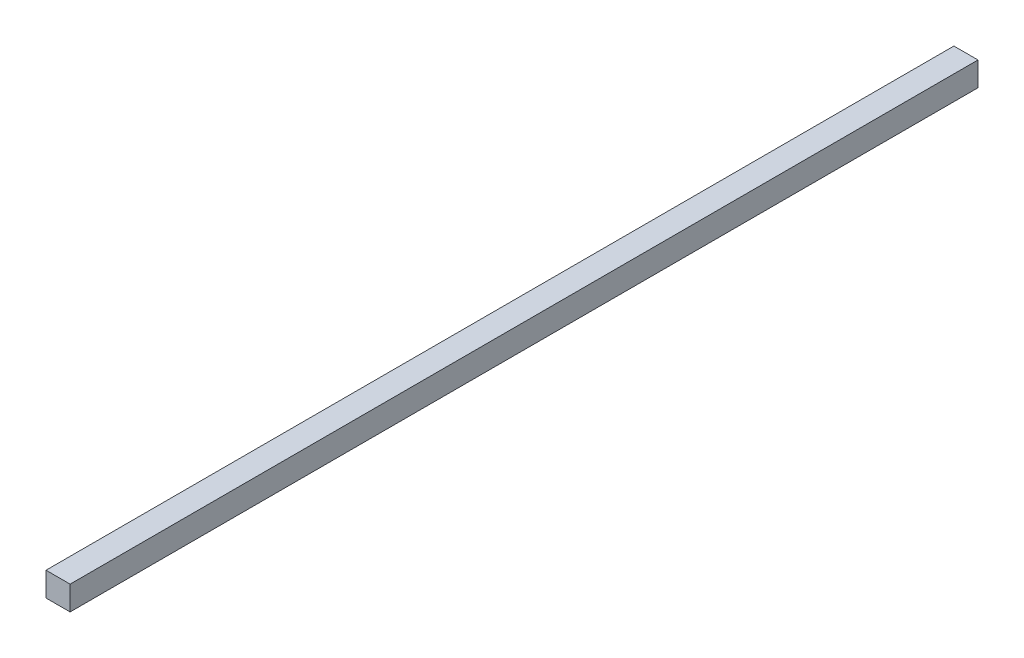
ISO-10303-21;
HEADER;
FILE_DESCRIPTION(('STEP AP214'),'2;1');
FILE_NAME('part.step','',(''),(''),'','','');
FILE_SCHEMA(('AUTOMOTIVE_DESIGN { 1 0 10303 214 1 1 1 1 }'));
ENDSEC;
DATA;
#1=APPLICATION_CONTEXT('core data for automotive mechanical design processes');
#2=APPLICATION_PROTOCOL_DEFINITION('international standard','automotive_design',2000,#1);
#3=PRODUCT_CONTEXT('',#1,'mechanical');
#4=PRODUCT('Part','Part','',(#3));
#5=PRODUCT_RELATED_PRODUCT_CATEGORY('part','',(#4));
#6=PRODUCT_DEFINITION_FORMATION('','',#4);
#7=PRODUCT_DEFINITION_CONTEXT('part definition',#1,'design');
#8=PRODUCT_DEFINITION('design','',#6,#7);
#9=PRODUCT_DEFINITION_SHAPE('','',#8);
#10=(LENGTH_UNIT() NAMED_UNIT(*) SI_UNIT(.MILLI.,.METRE.));
#11=(NAMED_UNIT(*) PLANE_ANGLE_UNIT() SI_UNIT($,.RADIAN.));
#12=(NAMED_UNIT(*) SI_UNIT($,.STERADIAN.) SOLID_ANGLE_UNIT());
#13=UNCERTAINTY_MEASURE_WITH_UNIT(LENGTH_MEASURE(1.E-05),#10,'distance_accuracy_value','');
#14=(GEOMETRIC_REPRESENTATION_CONTEXT(3) GLOBAL_UNCERTAINTY_ASSIGNED_CONTEXT((#13)) GLOBAL_UNIT_ASSIGNED_CONTEXT((#10,
#11,#12)) REPRESENTATION_CONTEXT('',''));
#15=CARTESIAN_POINT('',(0.,0.,0.));
#16=DIRECTION('',(0.,0.,1.));
#17=DIRECTION('',(1.,0.,0.));
#18=AXIS2_PLACEMENT_3D('',#15,#16,#17);
#19=CARTESIAN_POINT('',(12.,0.,0.));
#20=DIRECTION('',(0.,0.,-1.));
#21=DIRECTION('',(-1.,0.,0.));
#22=AXIS2_PLACEMENT_3D('',#19,#20,#21);
#23=PLANE('',#22);
#24=DIRECTION('',(0.,-1.,0.));
#25=VECTOR('',#24,1.);
#26=CARTESIAN_POINT('',(0.,0.,0.));
#27=LINE('',#26,#25);
#28=CARTESIAN_POINT('',(0.,12.,0.));
#29=VERTEX_POINT('',#28);
#30=CARTESIAN_POINT('',(0.,0.,0.));
#31=VERTEX_POINT('',#30);
#32=EDGE_CURVE('E96',#29,#31,#27,.T.);
#33=ORIENTED_EDGE('',*,*,#32,.T.);
#34=DIRECTION('',(-1.,0.,0.));
#35=VECTOR('',#34,1.);
#36=CARTESIAN_POINT('',(12.,0.,0.));
#37=LINE('',#36,#35);
#38=CARTESIAN_POINT('',(12.,0.,0.));
#39=VERTEX_POINT('',#38);
#40=EDGE_CURVE('E11',#39,#31,#37,.T.);
#41=ORIENTED_EDGE('',*,*,#40,.F.);
#42=DIRECTION('',(0.,-1.,0.));
#43=VECTOR('',#42,1.);
#44=CARTESIAN_POINT('',(12.,0.,0.));
#45=LINE('',#44,#43);
#46=CARTESIAN_POINT('',(12.,12.,0.));
#47=VERTEX_POINT('',#46);
#48=EDGE_CURVE('E84',#47,#39,#45,.T.);
#49=ORIENTED_EDGE('',*,*,#48,.F.);
#50=DIRECTION('',(-1.,0.,0.));
#51=VECTOR('',#50,1.);
#52=CARTESIAN_POINT('',(12.,12.,0.));
#53=LINE('',#52,#51);
#54=EDGE_CURVE('E92',#47,#29,#53,.T.);
#55=ORIENTED_EDGE('',*,*,#54,.T.);
#56=EDGE_LOOP('',(#33,#41,#49,#55));
#57=FACE_BOUND('',#56,.T.);
#58=ADVANCED_FACE('F33',(#57),#23,.F.);
#59=CARTESIAN_POINT('',(12.,0.,0.));
#60=DIRECTION('',(0.,1.,0.));
#61=DIRECTION('',(0.,0.,1.));
#62=AXIS2_PLACEMENT_3D('',#59,#60,#61);
#63=PLANE('',#62);
#64=DIRECTION('',(0.,0.,-1.));
#65=VECTOR('',#64,1.);
#66=CARTESIAN_POINT('',(0.,0.,0.));
#67=LINE('',#66,#65);
#68=CARTESIAN_POINT('',(0.,0.,-452.));
#69=VERTEX_POINT('',#68);
#70=EDGE_CURVE('E88',#31,#69,#67,.T.);
#71=ORIENTED_EDGE('',*,*,#70,.T.);
#72=DIRECTION('',(-1.,0.,0.));
#73=VECTOR('',#72,1.);
#74=CARTESIAN_POINT('',(12.,0.,-452.));
#75=LINE('',#74,#73);
#76=CARTESIAN_POINT('',(12.,0.,-452.));
#77=VERTEX_POINT('',#76);
#78=EDGE_CURVE('E41',#77,#69,#75,.T.);
#79=ORIENTED_EDGE('',*,*,#78,.F.);
#80=DIRECTION('',(0.,0.,-1.));
#81=VECTOR('',#80,1.);
#82=CARTESIAN_POINT('',(12.,0.,0.));
#83=LINE('',#82,#81);
#84=EDGE_CURVE('E79',#39,#77,#83,.T.);
#85=ORIENTED_EDGE('',*,*,#84,.F.);
#86=ORIENTED_EDGE('',*,*,#40,.T.);
#87=EDGE_LOOP('',(#71,#79,#85,#86));
#88=FACE_BOUND('',#87,.T.);
#89=ADVANCED_FACE('F87',(#88),#63,.F.);
#90=CARTESIAN_POINT('',(12.,0.,-452.));
#91=DIRECTION('',(0.,0.,1.));
#92=DIRECTION('',(1.,0.,0.));
#93=AXIS2_PLACEMENT_3D('',#90,#91,#92);
#94=PLANE('',#93);
#95=DIRECTION('',(0.,1.,0.));
#96=VECTOR('',#95,1.);
#97=CARTESIAN_POINT('',(0.,0.,-452.));
#98=LINE('',#97,#96);
#99=CARTESIAN_POINT('',(0.,12.,-452.));
#100=VERTEX_POINT('',#99);
#101=EDGE_CURVE('E66',#69,#100,#98,.T.);
#102=ORIENTED_EDGE('',*,*,#101,.T.);
#103=DIRECTION('',(-1.,0.,0.));
#104=VECTOR('',#103,1.);
#105=CARTESIAN_POINT('',(12.,12.,-452.));
#106=LINE('',#105,#104);
#107=CARTESIAN_POINT('',(12.,12.,-452.));
#108=VERTEX_POINT('',#107);
#109=EDGE_CURVE('E89',#108,#100,#106,.T.);
#110=ORIENTED_EDGE('',*,*,#109,.F.);
#111=DIRECTION('',(0.,1.,0.));
#112=VECTOR('',#111,1.);
#113=CARTESIAN_POINT('',(12.,0.,-452.));
#114=LINE('',#113,#112);
#115=EDGE_CURVE('E82',#77,#108,#114,.T.);
#116=ORIENTED_EDGE('',*,*,#115,.F.);
#117=ORIENTED_EDGE('',*,*,#78,.T.);
#118=EDGE_LOOP('',(#102,#110,#116,#117));
#119=FACE_BOUND('',#118,.T.);
#120=ADVANCED_FACE('F90',(#119),#94,.F.);
#121=CARTESIAN_POINT('',(12.,12.,0.));
#122=DIRECTION('',(0.,-1.,0.));
#123=DIRECTION('',(0.,0.,-1.));
#124=AXIS2_PLACEMENT_3D('',#121,#122,#123);
#125=PLANE('',#124);
#126=DIRECTION('',(0.,0.,1.));
#127=VECTOR('',#126,1.);
#128=CARTESIAN_POINT('',(0.,12.,0.));
#129=LINE('',#128,#127);
#130=EDGE_CURVE('E72',#100,#29,#129,.T.);
#131=ORIENTED_EDGE('',*,*,#130,.T.);
#132=ORIENTED_EDGE('',*,*,#54,.F.);
#133=DIRECTION('',(0.,0.,1.));
#134=VECTOR('',#133,1.);
#135=CARTESIAN_POINT('',(12.,12.,0.));
#136=LINE('',#135,#134);
#137=EDGE_CURVE('E49',#108,#47,#136,.T.);
#138=ORIENTED_EDGE('',*,*,#137,.F.);
#139=ORIENTED_EDGE('',*,*,#109,.T.);
#140=EDGE_LOOP('',(#131,#132,#138,#139));
#141=FACE_BOUND('',#140,.T.);
#142=ADVANCED_FACE('F103',(#141),#125,.F.);
#143=CARTESIAN_POINT('',(12.,0.,0.));
#144=DIRECTION('',(-1.,0.,0.));
#145=DIRECTION('',(0.,0.,1.));
#146=AXIS2_PLACEMENT_3D('',#143,#144,#145);
#147=PLANE('',#146);
#148=ORIENTED_EDGE('',*,*,#48,.T.);
#149=ORIENTED_EDGE('',*,*,#84,.T.);
#150=ORIENTED_EDGE('',*,*,#115,.T.);
#151=ORIENTED_EDGE('',*,*,#137,.T.);
#152=EDGE_LOOP('',(#148,#149,#150,#151));
#153=FACE_BOUND('',#152,.T.);
#154=ADVANCED_FACE('F80',(#153),#147,.F.);
#155=CARTESIAN_POINT('',(0.,0.,0.));
#156=DIRECTION('',(-1.,0.,0.));
#157=DIRECTION('',(0.,0.,1.));
#158=AXIS2_PLACEMENT_3D('',#155,#156,#157);
#159=PLANE('',#158);
#160=ORIENTED_EDGE('',*,*,#32,.F.);
#161=ORIENTED_EDGE('',*,*,#130,.F.);
#162=ORIENTED_EDGE('',*,*,#101,.F.);
#163=ORIENTED_EDGE('',*,*,#70,.F.);
#164=EDGE_LOOP('',(#160,#161,#162,#163));
#165=FACE_BOUND('',#164,.T.);
#166=ADVANCED_FACE('F106',(#165),#159,.T.);
#167=CLOSED_SHELL('',(#58,#89,#120,#142,#154,#166));
#168=MANIFOLD_SOLID_BREP('B2',#167);
#169=ADVANCED_BREP_SHAPE_REPRESENTATION('',(#18,#168),#14);
#170=SHAPE_DEFINITION_REPRESENTATION(#9,#169);
ENDSEC;
END-ISO-10303-21;
